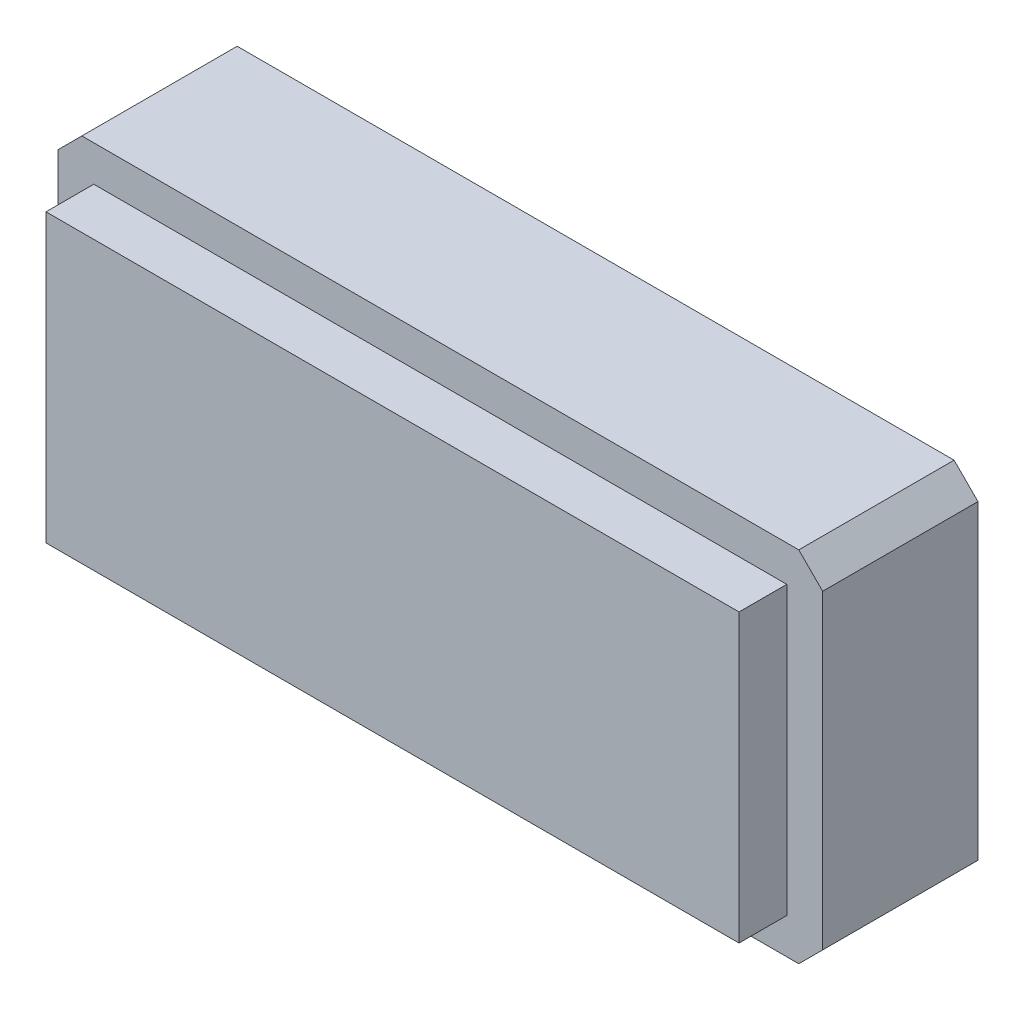
ISO-10303-21;
HEADER;
FILE_DESCRIPTION(('STEP AP214'),'2;1');
FILE_NAME('part.step','',(''),(''),'','','');
FILE_SCHEMA(('AUTOMOTIVE_DESIGN { 1 0 10303 214 1 1 1 1 }'));
ENDSEC;
DATA;
#1=APPLICATION_CONTEXT('core data for automotive mechanical design processes');
#2=APPLICATION_PROTOCOL_DEFINITION('international standard','automotive_design',2000,#1);
#3=PRODUCT_CONTEXT('',#1,'mechanical');
#4=PRODUCT('Part','Part','',(#3));
#5=PRODUCT_RELATED_PRODUCT_CATEGORY('part','',(#4));
#6=PRODUCT_DEFINITION_FORMATION('','',#4);
#7=PRODUCT_DEFINITION_CONTEXT('part definition',#1,'design');
#8=PRODUCT_DEFINITION('design','',#6,#7);
#9=PRODUCT_DEFINITION_SHAPE('','',#8);
#10=(LENGTH_UNIT() NAMED_UNIT(*) SI_UNIT(.MILLI.,.METRE.));
#11=(NAMED_UNIT(*) PLANE_ANGLE_UNIT() SI_UNIT($,.RADIAN.));
#12=(NAMED_UNIT(*) SI_UNIT($,.STERADIAN.) SOLID_ANGLE_UNIT());
#13=UNCERTAINTY_MEASURE_WITH_UNIT(LENGTH_MEASURE(1.E-05),#10,'distance_accuracy_value','');
#14=(GEOMETRIC_REPRESENTATION_CONTEXT(3) GLOBAL_UNCERTAINTY_ASSIGNED_CONTEXT((#13)) GLOBAL_UNIT_ASSIGNED_CONTEXT((#10,
#11,#12)) REPRESENTATION_CONTEXT('',''));
#15=CARTESIAN_POINT('',(0.,0.,0.));
#16=DIRECTION('',(0.,0.,1.));
#17=DIRECTION('',(1.,0.,0.));
#18=AXIS2_PLACEMENT_3D('',#15,#16,#17);
#19=CARTESIAN_POINT('',(0.,0.,0.85));
#20=DIRECTION('',(0.,0.,1.));
#21=DIRECTION('',(1.,0.,0.));
#22=AXIS2_PLACEMENT_3D('',#19,#20,#21);
#23=PLANE('',#22);
#24=DIRECTION('',(0.,1.,0.));
#25=VECTOR('',#24,1.);
#26=CARTESIAN_POINT('',(1.45,0.,0.85));
#27=LINE('',#26,#25);
#28=CARTESIAN_POINT('',(1.45,-0.6,0.85));
#29=VERTEX_POINT('',#28);
#30=CARTESIAN_POINT('',(1.45,0.6,0.85));
#31=VERTEX_POINT('',#30);
#32=EDGE_CURVE('E20',#29,#31,#27,.T.);
#33=ORIENTED_EDGE('',*,*,#32,.T.);
#34=DIRECTION('',(1.,0.,0.));
#35=VECTOR('',#34,1.);
#36=CARTESIAN_POINT('',(-1.45,0.6,0.85));
#37=LINE('',#36,#35);
#38=CARTESIAN_POINT('',(-1.45,0.6,0.85));
#39=VERTEX_POINT('',#38);
#40=EDGE_CURVE('E120',#31,#39,#37,.F.);
#41=ORIENTED_EDGE('',*,*,#40,.T.);
#42=DIRECTION('',(0.,1.,0.));
#43=VECTOR('',#42,1.);
#44=CARTESIAN_POINT('',(-1.45,0.6,0.85));
#45=LINE('',#44,#43);
#46=CARTESIAN_POINT('',(-1.45,-0.6,0.85));
#47=VERTEX_POINT('',#46);
#48=EDGE_CURVE('E104',#39,#47,#45,.F.);
#49=ORIENTED_EDGE('',*,*,#48,.T.);
#50=DIRECTION('',(1.,0.,0.));
#51=VECTOR('',#50,1.);
#52=CARTESIAN_POINT('',(-1.45,-0.6,0.85));
#53=LINE('',#52,#51);
#54=EDGE_CURVE('E111',#47,#29,#53,.T.);
#55=ORIENTED_EDGE('',*,*,#54,.T.);
#56=EDGE_LOOP('',(#33,#41,#49,#55));
#57=FACE_BOUND('',#56,.T.);
#58=ADVANCED_FACE('F17',(#57),#23,.T.);
#59=CARTESIAN_POINT('',(-1.45,-0.6,0.85));
#60=DIRECTION('',(0.,1.,0.));
#61=DIRECTION('',(0.,0.,1.));
#62=AXIS2_PLACEMENT_3D('',#59,#60,#61);
#63=PLANE('',#62);
#64=DIRECTION('',(0.,0.,1.));
#65=VECTOR('',#64,1.);
#66=CARTESIAN_POINT('',(1.45,-0.6,0.85));
#67=LINE('',#66,#65);
#68=CARTESIAN_POINT('',(1.45,-0.6,0.65));
#69=VERTEX_POINT('',#68);
#70=EDGE_CURVE('E116',#69,#29,#67,.T.);
#71=ORIENTED_EDGE('',*,*,#70,.T.);
#72=ORIENTED_EDGE('',*,*,#54,.F.);
#73=DIRECTION('',(0.,0.,-1.));
#74=VECTOR('',#73,1.);
#75=CARTESIAN_POINT('',(-1.45,-0.6,0.85));
#76=LINE('',#75,#74);
#77=CARTESIAN_POINT('',(-1.45,-0.6,0.65));
#78=VERTEX_POINT('',#77);
#79=EDGE_CURVE('E114',#47,#78,#76,.T.);
#80=ORIENTED_EDGE('',*,*,#79,.T.);
#81=DIRECTION('',(1.,0.,0.));
#82=VECTOR('',#81,1.);
#83=CARTESIAN_POINT('',(0.,-0.6,0.65));
#84=LINE('',#83,#82);
#85=EDGE_CURVE('E133',#69,#78,#84,.F.);
#86=ORIENTED_EDGE('',*,*,#85,.F.);
#87=EDGE_LOOP('',(#71,#72,#80,#86));
#88=FACE_BOUND('',#87,.T.);
#89=ADVANCED_FACE('F112',(#88),#63,.F.);
#90=CARTESIAN_POINT('',(-1.45,0.6,0.85));
#91=DIRECTION('',(1.,0.,0.));
#92=DIRECTION('',(0.,0.,-1.));
#93=AXIS2_PLACEMENT_3D('',#90,#91,#92);
#94=PLANE('',#93);
#95=ORIENTED_EDGE('',*,*,#79,.F.);
#96=ORIENTED_EDGE('',*,*,#48,.F.);
#97=DIRECTION('',(0.,0.,-1.));
#98=VECTOR('',#97,1.);
#99=CARTESIAN_POINT('',(-1.45,0.6,0.85));
#100=LINE('',#99,#98);
#101=CARTESIAN_POINT('',(-1.45,0.6,0.65));
#102=VERTEX_POINT('',#101);
#103=EDGE_CURVE('E127',#39,#102,#100,.T.);
#104=ORIENTED_EDGE('',*,*,#103,.T.);
#105=DIRECTION('',(0.,1.,0.));
#106=VECTOR('',#105,1.);
#107=CARTESIAN_POINT('',(-1.45,0.,0.65));
#108=LINE('',#107,#106);
#109=EDGE_CURVE('E119',#78,#102,#108,.T.);
#110=ORIENTED_EDGE('',*,*,#109,.F.);
#111=EDGE_LOOP('',(#95,#96,#104,#110));
#112=FACE_BOUND('',#111,.T.);
#113=ADVANCED_FACE('F118',(#112),#94,.F.);
#114=CARTESIAN_POINT('',(-1.45,0.6,0.85));
#115=DIRECTION('',(0.,-1.,0.));
#116=DIRECTION('',(0.,0.,-1.));
#117=AXIS2_PLACEMENT_3D('',#114,#115,#116);
#118=PLANE('',#117);
#119=ORIENTED_EDGE('',*,*,#103,.F.);
#120=ORIENTED_EDGE('',*,*,#40,.F.);
#121=DIRECTION('',(0.,0.,1.));
#122=VECTOR('',#121,1.);
#123=CARTESIAN_POINT('',(1.45,0.6,0.85));
#124=LINE('',#123,#122);
#125=CARTESIAN_POINT('',(1.45,0.6,0.65));
#126=VERTEX_POINT('',#125);
#127=EDGE_CURVE('E130',#31,#126,#124,.F.);
#128=ORIENTED_EDGE('',*,*,#127,.T.);
#129=DIRECTION('',(1.,0.,0.));
#130=VECTOR('',#129,1.);
#131=CARTESIAN_POINT('',(0.,0.6,0.65));
#132=LINE('',#131,#130);
#133=EDGE_CURVE('E136',#102,#126,#132,.T.);
#134=ORIENTED_EDGE('',*,*,#133,.F.);
#135=EDGE_LOOP('',(#119,#120,#128,#134));
#136=FACE_BOUND('',#135,.T.);
#137=ADVANCED_FACE('F258',(#136),#118,.F.);
#138=CARTESIAN_POINT('',(1.45,0.6,0.85));
#139=DIRECTION('',(-1.,0.,0.));
#140=DIRECTION('',(0.,-1.,0.));
#141=AXIS2_PLACEMENT_3D('',#138,#139,#140);
#142=PLANE('',#141);
#143=ORIENTED_EDGE('',*,*,#127,.F.);
#144=ORIENTED_EDGE('',*,*,#32,.F.);
#145=ORIENTED_EDGE('',*,*,#70,.F.);
#146=DIRECTION('',(0.,1.,0.));
#147=VECTOR('',#146,1.);
#148=CARTESIAN_POINT('',(1.45,0.,0.65));
#149=LINE('',#148,#147);
#150=EDGE_CURVE('E138',#126,#69,#149,.F.);
#151=ORIENTED_EDGE('',*,*,#150,.F.);
#152=EDGE_LOOP('',(#143,#144,#145,#151));
#153=FACE_BOUND('',#152,.T.);
#154=ADVANCED_FACE('F254',(#153),#142,.F.);
#155=CARTESIAN_POINT('',(0.,0.,0.65));
#156=DIRECTION('',(0.,0.,1.));
#157=DIRECTION('',(1.,0.,0.));
#158=AXIS2_PLACEMENT_3D('',#155,#156,#157);
#159=PLANE('',#158);
#160=ORIENTED_EDGE('',*,*,#133,.T.);
#161=ORIENTED_EDGE('',*,*,#150,.T.);
#162=ORIENTED_EDGE('',*,*,#85,.T.);
#163=ORIENTED_EDGE('',*,*,#109,.T.);
#164=EDGE_LOOP('',(#160,#161,#162,#163));
#165=FACE_BOUND('',#164,.T.);
#166=DIRECTION('',(1.,0.,0.));
#167=VECTOR('',#166,1.);
#168=CARTESIAN_POINT('',(-1.6,-0.75,0.65));
#169=LINE('',#168,#167);
#170=CARTESIAN_POINT('',(-1.5,-0.75,0.65));
#171=VERTEX_POINT('',#170);
#172=CARTESIAN_POINT('',(1.5,-0.75,0.65));
#173=VERTEX_POINT('',#172);
#174=EDGE_CURVE('E156',#171,#173,#169,.T.);
#175=ORIENTED_EDGE('',*,*,#174,.T.);
#176=DIRECTION('',(-0.707106781186548,-0.707106781186548,0.));
#177=VECTOR('',#176,1.);
#178=CARTESIAN_POINT('',(1.6,-0.65,0.65));
#179=LINE('',#178,#177);
#180=CARTESIAN_POINT('',(1.6,-0.65,0.65));
#181=VERTEX_POINT('',#180);
#182=EDGE_CURVE('E161',#173,#181,#179,.F.);
#183=ORIENTED_EDGE('',*,*,#182,.T.);
#184=DIRECTION('',(0.,-1.,0.));
#185=VECTOR('',#184,1.);
#186=CARTESIAN_POINT('',(1.6,0.75,0.65));
#187=LINE('',#186,#185);
#188=CARTESIAN_POINT('',(1.6,0.65,0.65));
#189=VERTEX_POINT('',#188);
#190=EDGE_CURVE('E166',#181,#189,#187,.F.);
#191=ORIENTED_EDGE('',*,*,#190,.T.);
#192=DIRECTION('',(0.707106781186548,-0.707106781186548,0.));
#193=VECTOR('',#192,1.);
#194=CARTESIAN_POINT('',(1.5,0.75,0.65));
#195=LINE('',#194,#193);
#196=CARTESIAN_POINT('',(1.5,0.75,0.65));
#197=VERTEX_POINT('',#196);
#198=EDGE_CURVE('E171',#189,#197,#195,.F.);
#199=ORIENTED_EDGE('',*,*,#198,.T.);
#200=DIRECTION('',(1.,0.,0.));
#201=VECTOR('',#200,1.);
#202=CARTESIAN_POINT('',(-1.6,0.75,0.65));
#203=LINE('',#202,#201);
#204=CARTESIAN_POINT('',(-1.5,0.75,0.65));
#205=VERTEX_POINT('',#204);
#206=EDGE_CURVE('E177',#197,#205,#203,.F.);
#207=ORIENTED_EDGE('',*,*,#206,.T.);
#208=DIRECTION('',(0.707106781186548,0.707106781186548,0.));
#209=VECTOR('',#208,1.);
#210=CARTESIAN_POINT('',(-1.6,0.65,0.65));
#211=LINE('',#210,#209);
#212=CARTESIAN_POINT('',(-1.6,0.65,0.65));
#213=VERTEX_POINT('',#212);
#214=EDGE_CURVE('E141',#205,#213,#211,.F.);
#215=ORIENTED_EDGE('',*,*,#214,.T.);
#216=DIRECTION('',(0.,1.,0.));
#217=VECTOR('',#216,1.);
#218=CARTESIAN_POINT('',(-1.6,0.75,0.65));
#219=LINE('',#218,#217);
#220=CARTESIAN_POINT('',(-1.6,-0.65,0.65));
#221=VERTEX_POINT('',#220);
#222=EDGE_CURVE('E146',#213,#221,#219,.F.);
#223=ORIENTED_EDGE('',*,*,#222,.T.);
#224=DIRECTION('',(-0.707106781186548,0.707106781186548,0.));
#225=VECTOR('',#224,1.);
#226=CARTESIAN_POINT('',(-1.5,-0.75,0.65));
#227=LINE('',#226,#225);
#228=EDGE_CURVE('E151',#221,#171,#227,.F.);
#229=ORIENTED_EDGE('',*,*,#228,.T.);
#230=EDGE_LOOP('',(#175,#183,#191,#199,#207,#215,#223,#229));
#231=FACE_BOUND('',#230,.T.);
#232=ADVANCED_FACE('F251',(#165,#231),#159,.T.);
#233=CARTESIAN_POINT('',(-1.6,0.65,0.65));
#234=DIRECTION('',(0.707106781186548,-0.707106781186548,0.));
#235=DIRECTION('',(0.707106781186548,0.707106781186548,0.));
#236=AXIS2_PLACEMENT_3D('',#233,#234,#235);
#237=PLANE('',#236);
#238=DIRECTION('',(0.,0.,1.));
#239=VECTOR('',#238,1.);
#240=CARTESIAN_POINT('',(-1.5,0.75,0.65));
#241=LINE('',#240,#239);
#242=CARTESIAN_POINT('',(-1.5,0.75,0.));
#243=VERTEX_POINT('',#242);
#244=EDGE_CURVE('E173',#205,#243,#241,.F.);
#245=ORIENTED_EDGE('',*,*,#244,.T.);
#246=DIRECTION('',(-0.707106781186548,-0.707106781186547,0.));
#247=VECTOR('',#246,1.);
#248=CARTESIAN_POINT('',(-1.5,0.75,0.));
#249=LINE('',#248,#247);
#250=CARTESIAN_POINT('',(-1.6,0.65,0.));
#251=VERTEX_POINT('',#250);
#252=EDGE_CURVE('E180',#243,#251,#249,.T.);
#253=ORIENTED_EDGE('',*,*,#252,.T.);
#254=DIRECTION('',(0.,0.,1.));
#255=VECTOR('',#254,1.);
#256=CARTESIAN_POINT('',(-1.6,0.65,0.65));
#257=LINE('',#256,#255);
#258=EDGE_CURVE('E143',#251,#213,#257,.T.);
#259=ORIENTED_EDGE('',*,*,#258,.T.);
#260=ORIENTED_EDGE('',*,*,#214,.F.);
#261=EDGE_LOOP('',(#245,#253,#259,#260));
#262=FACE_BOUND('',#261,.T.);
#263=ADVANCED_FACE('F226',(#262),#237,.F.);
#264=CARTESIAN_POINT('',(-1.6,0.75,0.65));
#265=DIRECTION('',(1.,0.,0.));
#266=DIRECTION('',(0.,1.,0.));
#267=AXIS2_PLACEMENT_3D('',#264,#265,#266);
#268=PLANE('',#267);
#269=ORIENTED_EDGE('',*,*,#258,.F.);
#270=DIRECTION('',(0.,1.,0.));
#271=VECTOR('',#270,1.);
#272=CARTESIAN_POINT('',(-1.6,0.,0.));
#273=LINE('',#272,#271);
#274=CARTESIAN_POINT('',(-1.6,-0.65,0.));
#275=VERTEX_POINT('',#274);
#276=EDGE_CURVE('E183',#251,#275,#273,.F.);
#277=ORIENTED_EDGE('',*,*,#276,.T.);
#278=DIRECTION('',(0.,0.,1.));
#279=VECTOR('',#278,1.);
#280=CARTESIAN_POINT('',(-1.6,-0.65,0.65));
#281=LINE('',#280,#279);
#282=EDGE_CURVE('E148',#275,#221,#281,.T.);
#283=ORIENTED_EDGE('',*,*,#282,.T.);
#284=ORIENTED_EDGE('',*,*,#222,.F.);
#285=EDGE_LOOP('',(#269,#277,#283,#284));
#286=FACE_BOUND('',#285,.T.);
#287=ADVANCED_FACE('F223',(#286),#268,.F.);
#288=CARTESIAN_POINT('',(-1.5,-0.75,0.65));
#289=DIRECTION('',(0.707106781186548,0.707106781186548,0.));
#290=DIRECTION('',(-0.707106781186548,0.707106781186548,0.));
#291=AXIS2_PLACEMENT_3D('',#288,#289,#290);
#292=PLANE('',#291);
#293=ORIENTED_EDGE('',*,*,#282,.F.);
#294=DIRECTION('',(0.707106781186548,-0.707106781186547,0.));
#295=VECTOR('',#294,1.);
#296=CARTESIAN_POINT('',(-1.6,-0.65,0.));
#297=LINE('',#296,#295);
#298=CARTESIAN_POINT('',(-1.5,-0.75,0.));
#299=VERTEX_POINT('',#298);
#300=EDGE_CURVE('E186',#275,#299,#297,.T.);
#301=ORIENTED_EDGE('',*,*,#300,.T.);
#302=DIRECTION('',(0.,0.,1.));
#303=VECTOR('',#302,1.);
#304=CARTESIAN_POINT('',(-1.5,-0.75,0.65));
#305=LINE('',#304,#303);
#306=EDGE_CURVE('E153',#299,#171,#305,.T.);
#307=ORIENTED_EDGE('',*,*,#306,.T.);
#308=ORIENTED_EDGE('',*,*,#228,.F.);
#309=EDGE_LOOP('',(#293,#301,#307,#308));
#310=FACE_BOUND('',#309,.T.);
#311=ADVANCED_FACE('F220',(#310),#292,.F.);
#312=CARTESIAN_POINT('',(-1.6,-0.75,0.65));
#313=DIRECTION('',(0.,1.,0.));
#314=DIRECTION('',(0.,0.,1.));
#315=AXIS2_PLACEMENT_3D('',#312,#313,#314);
#316=PLANE('',#315);
#317=DIRECTION('',(0.,0.,1.));
#318=VECTOR('',#317,1.);
#319=CARTESIAN_POINT('',(1.5,-0.75,0.65));
#320=LINE('',#319,#318);
#321=CARTESIAN_POINT('',(1.5,-0.75,0.));
#322=VERTEX_POINT('',#321);
#323=EDGE_CURVE('E158',#322,#173,#320,.T.);
#324=ORIENTED_EDGE('',*,*,#323,.T.);
#325=ORIENTED_EDGE('',*,*,#174,.F.);
#326=ORIENTED_EDGE('',*,*,#306,.F.);
#327=DIRECTION('',(1.,0.,0.));
#328=VECTOR('',#327,1.);
#329=CARTESIAN_POINT('',(0.,-0.75,0.));
#330=LINE('',#329,#328);
#331=EDGE_CURVE('E189',#299,#322,#330,.T.);
#332=ORIENTED_EDGE('',*,*,#331,.T.);
#333=EDGE_LOOP('',(#324,#325,#326,#332));
#334=FACE_BOUND('',#333,.T.);
#335=ADVANCED_FACE('F216',(#334),#316,.F.);
#336=CARTESIAN_POINT('',(1.6,-0.65,0.65));
#337=DIRECTION('',(-0.707106781186548,0.707106781186548,0.));
#338=DIRECTION('',(-0.707106781186548,-0.707106781186548,0.));
#339=AXIS2_PLACEMENT_3D('',#336,#337,#338);
#340=PLANE('',#339);
#341=ORIENTED_EDGE('',*,*,#323,.F.);
#342=DIRECTION('',(0.707106781186548,0.707106781186547,0.));
#343=VECTOR('',#342,1.);
#344=CARTESIAN_POINT('',(1.5,-0.75,0.));
#345=LINE('',#344,#343);
#346=CARTESIAN_POINT('',(1.6,-0.65,0.));
#347=VERTEX_POINT('',#346);
#348=EDGE_CURVE('E192',#322,#347,#345,.T.);
#349=ORIENTED_EDGE('',*,*,#348,.T.);
#350=DIRECTION('',(0.,0.,1.));
#351=VECTOR('',#350,1.);
#352=CARTESIAN_POINT('',(1.6,-0.65,0.65));
#353=LINE('',#352,#351);
#354=EDGE_CURVE('E163',#347,#181,#353,.T.);
#355=ORIENTED_EDGE('',*,*,#354,.T.);
#356=ORIENTED_EDGE('',*,*,#182,.F.);
#357=EDGE_LOOP('',(#341,#349,#355,#356));
#358=FACE_BOUND('',#357,.T.);
#359=ADVANCED_FACE('F212',(#358),#340,.F.);
#360=CARTESIAN_POINT('',(1.6,0.75,0.65));
#361=DIRECTION('',(-1.,0.,0.));
#362=DIRECTION('',(0.,-1.,0.));
#363=AXIS2_PLACEMENT_3D('',#360,#361,#362);
#364=PLANE('',#363);
#365=DIRECTION('',(0.,0.,1.));
#366=VECTOR('',#365,1.);
#367=CARTESIAN_POINT('',(1.6,0.65,0.65));
#368=LINE('',#367,#366);
#369=CARTESIAN_POINT('',(1.6,0.65,0.));
#370=VERTEX_POINT('',#369);
#371=EDGE_CURVE('E168',#370,#189,#368,.T.);
#372=ORIENTED_EDGE('',*,*,#371,.T.);
#373=ORIENTED_EDGE('',*,*,#190,.F.);
#374=ORIENTED_EDGE('',*,*,#354,.F.);
#375=DIRECTION('',(0.,1.,0.));
#376=VECTOR('',#375,1.);
#377=CARTESIAN_POINT('',(1.6,0.,0.));
#378=LINE('',#377,#376);
#379=EDGE_CURVE('E195',#347,#370,#378,.T.);
#380=ORIENTED_EDGE('',*,*,#379,.T.);
#381=EDGE_LOOP('',(#372,#373,#374,#380));
#382=FACE_BOUND('',#381,.T.);
#383=ADVANCED_FACE('F208',(#382),#364,.F.);
#384=CARTESIAN_POINT('',(1.5,0.75,0.65));
#385=DIRECTION('',(-0.707106781186548,-0.707106781186548,0.));
#386=DIRECTION('',(0.707106781186548,-0.707106781186548,0.));
#387=AXIS2_PLACEMENT_3D('',#384,#385,#386);
#388=PLANE('',#387);
#389=ORIENTED_EDGE('',*,*,#371,.F.);
#390=DIRECTION('',(-0.707106781186548,0.707106781186547,0.));
#391=VECTOR('',#390,1.);
#392=CARTESIAN_POINT('',(1.6,0.65,0.));
#393=LINE('',#392,#391);
#394=CARTESIAN_POINT('',(1.5,0.75,0.));
#395=VERTEX_POINT('',#394);
#396=EDGE_CURVE('E26',#370,#395,#393,.T.);
#397=ORIENTED_EDGE('',*,*,#396,.T.);
#398=DIRECTION('',(0.,0.,1.));
#399=VECTOR('',#398,1.);
#400=CARTESIAN_POINT('',(1.5,0.75,0.65));
#401=LINE('',#400,#399);
#402=EDGE_CURVE('E34',#395,#197,#401,.T.);
#403=ORIENTED_EDGE('',*,*,#402,.T.);
#404=ORIENTED_EDGE('',*,*,#198,.F.);
#405=EDGE_LOOP('',(#389,#397,#403,#404));
#406=FACE_BOUND('',#405,.T.);
#407=ADVANCED_FACE('F201',(#406),#388,.F.);
#408=CARTESIAN_POINT('',(-1.6,0.75,0.65));
#409=DIRECTION('',(0.,-1.,0.));
#410=DIRECTION('',(1.,0.,0.));
#411=AXIS2_PLACEMENT_3D('',#408,#409,#410);
#412=PLANE('',#411);
#413=ORIENTED_EDGE('',*,*,#402,.F.);
#414=DIRECTION('',(1.,0.,0.));
#415=VECTOR('',#414,1.);
#416=CARTESIAN_POINT('',(0.,0.75,0.));
#417=LINE('',#416,#415);
#418=EDGE_CURVE('E11',#395,#243,#417,.F.);
#419=ORIENTED_EDGE('',*,*,#418,.T.);
#420=ORIENTED_EDGE('',*,*,#244,.F.);
#421=ORIENTED_EDGE('',*,*,#206,.F.);
#422=EDGE_LOOP('',(#413,#419,#420,#421));
#423=FACE_BOUND('',#422,.T.);
#424=ADVANCED_FACE('F228',(#423),#412,.F.);
#425=CARTESIAN_POINT('',(0.,0.,0.));
#426=DIRECTION('',(0.,0.,1.));
#427=DIRECTION('',(1.,0.,0.));
#428=AXIS2_PLACEMENT_3D('',#425,#426,#427);
#429=PLANE('',#428);
#430=ORIENTED_EDGE('',*,*,#396,.F.);
#431=ORIENTED_EDGE('',*,*,#379,.F.);
#432=ORIENTED_EDGE('',*,*,#348,.F.);
#433=ORIENTED_EDGE('',*,*,#331,.F.);
#434=ORIENTED_EDGE('',*,*,#300,.F.);
#435=ORIENTED_EDGE('',*,*,#276,.F.);
#436=ORIENTED_EDGE('',*,*,#252,.F.);
#437=ORIENTED_EDGE('',*,*,#418,.F.);
#438=EDGE_LOOP('',(#430,#431,#432,#433,#434,#435,#436,#437));
#439=FACE_BOUND('',#438,.T.);
#440=ADVANCED_FACE('F205',(#439),#429,.F.);
#441=CLOSED_SHELL('',(#58,#89,#113,#137,#154,#232,#263,#287,#311,#335,#359,#383,#407,#424,#440));
#442=MANIFOLD_SOLID_BREP('B1',#441);
#443=ADVANCED_BREP_SHAPE_REPRESENTATION('',(#18,#442),#14);
#444=SHAPE_DEFINITION_REPRESENTATION(#9,#443);
ENDSEC;
END-ISO-10303-21;
